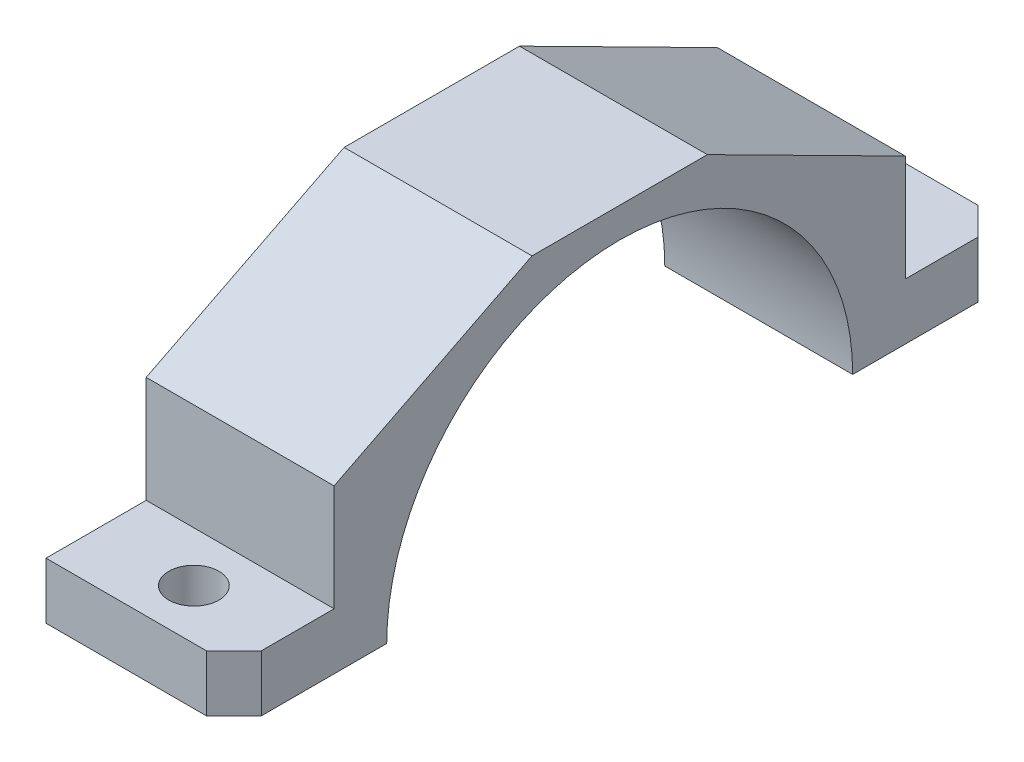
ISO-10303-21;
HEADER;
FILE_DESCRIPTION(('STEP AP214'),'2;1');
FILE_NAME('part.step','',(''),(''),'','','');
FILE_SCHEMA(('AUTOMOTIVE_DESIGN { 1 0 10303 214 1 1 1 1 }'));
ENDSEC;
DATA;
#1=APPLICATION_CONTEXT('core data for automotive mechanical design processes');
#2=APPLICATION_PROTOCOL_DEFINITION('international standard','automotive_design',2000,#1);
#3=PRODUCT_CONTEXT('',#1,'mechanical');
#4=PRODUCT('Part','Part','',(#3));
#5=PRODUCT_RELATED_PRODUCT_CATEGORY('part','',(#4));
#6=PRODUCT_DEFINITION_FORMATION('','',#4);
#7=PRODUCT_DEFINITION_CONTEXT('part definition',#1,'design');
#8=PRODUCT_DEFINITION('design','',#6,#7);
#9=PRODUCT_DEFINITION_SHAPE('','',#8);
#10=(LENGTH_UNIT() NAMED_UNIT(*) SI_UNIT(.MILLI.,.METRE.));
#11=(NAMED_UNIT(*) PLANE_ANGLE_UNIT() SI_UNIT($,.RADIAN.));
#12=(NAMED_UNIT(*) SI_UNIT($,.STERADIAN.) SOLID_ANGLE_UNIT());
#13=UNCERTAINTY_MEASURE_WITH_UNIT(LENGTH_MEASURE(1.E-05),#10,'distance_accuracy_value','');
#14=(GEOMETRIC_REPRESENTATION_CONTEXT(3) GLOBAL_UNCERTAINTY_ASSIGNED_CONTEXT((#13)) GLOBAL_UNIT_ASSIGNED_CONTEXT((#10,
#11,#12)) REPRESENTATION_CONTEXT('',''));
#15=CARTESIAN_POINT('',(0.,0.,0.));
#16=DIRECTION('',(0.,0.,1.));
#17=DIRECTION('',(1.,0.,0.));
#18=AXIS2_PLACEMENT_3D('',#15,#16,#17);
#19=CARTESIAN_POINT('',(7.5,13.,22.8));
#20=DIRECTION('',(0.,-0.892157158155219,-0.451725143369731));
#21=DIRECTION('',(0.,0.451725143369731,-0.892157158155219));
#22=AXIS2_PLACEMENT_3D('',#19,#20,#21);
#23=PLANE('',#22);
#24=DIRECTION('',(0.,-0.451725143369731,0.892157158155219));
#25=VECTOR('',#24,1.);
#26=CARTESIAN_POINT('',(-7.5,13.,22.8));
#27=LINE('',#26,#25);
#28=CARTESIAN_POINT('',(-7.5,21.,7.));
#29=VERTEX_POINT('',#28);
#30=CARTESIAN_POINT('',(-7.5,13.,22.8));
#31=VERTEX_POINT('',#30);
#32=EDGE_CURVE('E171',#29,#31,#27,.T.);
#33=ORIENTED_EDGE('',*,*,#32,.T.);
#34=DIRECTION('',(-1.,0.,0.));
#35=VECTOR('',#34,1.);
#36=CARTESIAN_POINT('',(7.5,13.,22.8));
#37=LINE('',#36,#35);
#38=CARTESIAN_POINT('',(7.5,13.,22.8));
#39=VERTEX_POINT('',#38);
#40=EDGE_CURVE('E226',#39,#31,#37,.T.);
#41=ORIENTED_EDGE('',*,*,#40,.F.);
#42=DIRECTION('',(0.,-0.451725143369731,0.892157158155219));
#43=VECTOR('',#42,1.);
#44=CARTESIAN_POINT('',(7.5,13.,22.8));
#45=LINE('',#44,#43);
#46=CARTESIAN_POINT('',(7.5,21.,7.));
#47=VERTEX_POINT('',#46);
#48=EDGE_CURVE('E199',#47,#39,#45,.T.);
#49=ORIENTED_EDGE('',*,*,#48,.F.);
#50=DIRECTION('',(-1.,0.,0.));
#51=VECTOR('',#50,1.);
#52=CARTESIAN_POINT('',(7.5,21.,7.));
#53=LINE('',#52,#51);
#54=EDGE_CURVE('E170',#47,#29,#53,.T.);
#55=ORIENTED_EDGE('',*,*,#54,.T.);
#56=EDGE_LOOP('',(#33,#41,#49,#55));
#57=FACE_BOUND('',#56,.T.);
#58=ADVANCED_FACE('F39',(#57),#23,.F.);
#59=CARTESIAN_POINT('',(7.5,4.5,22.8));
#60=DIRECTION('',(0.,0.,-1.));
#61=DIRECTION('',(-1.,0.,0.));
#62=AXIS2_PLACEMENT_3D('',#59,#60,#61);
#63=PLANE('',#62);
#64=DIRECTION('',(0.,-1.,0.));
#65=VECTOR('',#64,1.);
#66=CARTESIAN_POINT('',(-7.5,4.5,22.8));
#67=LINE('',#66,#65);
#68=CARTESIAN_POINT('',(-7.5,4.5,22.8));
#69=VERTEX_POINT('',#68);
#70=EDGE_CURVE('E174',#31,#69,#67,.T.);
#71=ORIENTED_EDGE('',*,*,#70,.T.);
#72=DIRECTION('',(-1.,0.,0.));
#73=VECTOR('',#72,1.);
#74=CARTESIAN_POINT('',(7.5,4.5,22.8));
#75=LINE('',#74,#73);
#76=CARTESIAN_POINT('',(7.5,4.5,22.8));
#77=VERTEX_POINT('',#76);
#78=EDGE_CURVE('E223',#77,#69,#75,.T.);
#79=ORIENTED_EDGE('',*,*,#78,.F.);
#80=DIRECTION('',(0.,-1.,0.));
#81=VECTOR('',#80,1.);
#82=CARTESIAN_POINT('',(7.5,4.5,22.8));
#83=LINE('',#82,#81);
#84=EDGE_CURVE('E238',#39,#77,#83,.T.);
#85=ORIENTED_EDGE('',*,*,#84,.F.);
#86=ORIENTED_EDGE('',*,*,#40,.T.);
#87=EDGE_LOOP('',(#71,#79,#85,#86));
#88=FACE_BOUND('',#87,.T.);
#89=ADVANCED_FACE('F286',(#88),#63,.F.);
#90=CARTESIAN_POINT('',(7.5,4.5,30.8));
#91=DIRECTION('',(0.,-1.,0.));
#92=DIRECTION('',(0.,0.,-1.));
#93=AXIS2_PLACEMENT_3D('',#90,#91,#92);
#94=PLANE('',#93);
#95=CARTESIAN_POINT('',(0.305249497121185,4.4999999999999,26.7999999999998));
#96=DIRECTION('',(0.,-1.,0.));
#97=DIRECTION('',(0.,0.,-1.));
#98=AXIS2_PLACEMENT_3D('',#95,#96,#97);
#99=CIRCLE('',#98,1.99999999999999);
#100=CARTESIAN_POINT('',(0.305249497121185,4.4999999999999,24.7999999999998));
#101=VERTEX_POINT('',#100);
#102=EDGE_CURVE('E251',#101,#101,#99,.T.);
#103=ORIENTED_EDGE('',*,*,#102,.T.);
#104=EDGE_LOOP('',(#103));
#105=FACE_BOUND('',#104,.T.);
#106=DIRECTION('',(-1.,0.,0.));
#107=VECTOR('',#106,1.);
#108=CARTESIAN_POINT('',(7.5,4.5,30.8));
#109=LINE('',#108,#107);
#110=CARTESIAN_POINT('',(5.30524949712216,4.50000000000001,30.8));
#111=VERTEX_POINT('',#110);
#112=CARTESIAN_POINT('',(-7.5,4.5,30.8));
#113=VERTEX_POINT('',#112);
#114=EDGE_CURVE('E221',#111,#113,#109,.T.);
#115=ORIENTED_EDGE('',*,*,#114,.F.);
#116=DIRECTION('',(0.70710678118655,0.,-0.707106781186545));
#117=VECTOR('',#116,1.);
#118=CARTESIAN_POINT('',(6.40262474856109,4.5,29.7026247485611));
#119=LINE('',#118,#117);
#120=CARTESIAN_POINT('',(7.5,4.50000000000001,28.6052494971222));
#121=VERTEX_POINT('',#120);
#122=EDGE_CURVE('E245',#111,#121,#119,.T.);
#123=ORIENTED_EDGE('',*,*,#122,.T.);
#124=DIRECTION('',(0.,0.,1.));
#125=VECTOR('',#124,1.);
#126=CARTESIAN_POINT('',(7.5,4.5,30.8));
#127=LINE('',#126,#125);
#128=EDGE_CURVE('E233',#77,#121,#127,.T.);
#129=ORIENTED_EDGE('',*,*,#128,.F.);
#130=ORIENTED_EDGE('',*,*,#78,.T.);
#131=DIRECTION('',(0.,0.,1.));
#132=VECTOR('',#131,1.);
#133=CARTESIAN_POINT('',(-7.5,4.5,30.8));
#134=LINE('',#133,#132);
#135=EDGE_CURVE('E176',#69,#113,#134,.T.);
#136=ORIENTED_EDGE('',*,*,#135,.T.);
#137=EDGE_LOOP('',(#115,#123,#129,#130,#136));
#138=FACE_BOUND('',#137,.T.);
#139=ADVANCED_FACE('F291',(#105,#138),#94,.F.);
#140=CARTESIAN_POINT('',(7.5,0.,30.8));
#141=DIRECTION('',(0.,0.,-1.));
#142=DIRECTION('',(-1.,0.,0.));
#143=AXIS2_PLACEMENT_3D('',#140,#141,#142);
#144=PLANE('',#143);
#145=DIRECTION('',(-1.,0.,0.));
#146=VECTOR('',#145,1.);
#147=CARTESIAN_POINT('',(7.5,0.,30.8));
#148=LINE('',#147,#146);
#149=CARTESIAN_POINT('',(5.30524949712216,0.,30.8));
#150=VERTEX_POINT('',#149);
#151=CARTESIAN_POINT('',(-7.5,0.,30.8));
#152=VERTEX_POINT('',#151);
#153=EDGE_CURVE('E219',#150,#152,#148,.T.);
#154=ORIENTED_EDGE('',*,*,#153,.F.);
#155=DIRECTION('',(0.,-1.,0.));
#156=VECTOR('',#155,1.);
#157=CARTESIAN_POINT('',(5.30524949712216,21.,30.8));
#158=LINE('',#157,#156);
#159=EDGE_CURVE('E248',#111,#150,#158,.T.);
#160=ORIENTED_EDGE('',*,*,#159,.F.);
#161=ORIENTED_EDGE('',*,*,#114,.T.);
#162=DIRECTION('',(0.,-1.,0.));
#163=VECTOR('',#162,1.);
#164=CARTESIAN_POINT('',(-7.5,0.,30.8));
#165=LINE('',#164,#163);
#166=EDGE_CURVE('E179',#113,#152,#165,.T.);
#167=ORIENTED_EDGE('',*,*,#166,.T.);
#168=EDGE_LOOP('',(#154,#160,#161,#167));
#169=FACE_BOUND('',#168,.T.);
#170=ADVANCED_FACE('F325',(#169),#144,.F.);
#171=CARTESIAN_POINT('',(7.5,0.,30.8));
#172=DIRECTION('',(0.,1.,0.));
#173=DIRECTION('',(0.,0.,1.));
#174=AXIS2_PLACEMENT_3D('',#171,#172,#173);
#175=PLANE('',#174);
#176=CARTESIAN_POINT('',(0.305249497121185,0.,26.7999999999998));
#177=DIRECTION('',(0.,1.,0.));
#178=DIRECTION('',(0.,0.,1.));
#179=AXIS2_PLACEMENT_3D('',#176,#177,#178);
#180=CIRCLE('',#179,2.);
#181=CARTESIAN_POINT('',(0.305249497121185,0.,28.7999999999998));
#182=VERTEX_POINT('',#181);
#183=EDGE_CURVE('E42',#182,#182,#180,.T.);
#184=ORIENTED_EDGE('',*,*,#183,.T.);
#185=EDGE_LOOP('',(#184));
#186=FACE_BOUND('',#185,.T.);
#187=DIRECTION('',(0.,0.,-1.));
#188=VECTOR('',#187,1.);
#189=CARTESIAN_POINT('',(7.5,0.,30.8));
#190=LINE('',#189,#188);
#191=CARTESIAN_POINT('',(7.5,0.,28.6052494971222));
#192=VERTEX_POINT('',#191);
#193=CARTESIAN_POINT('',(7.5,0.,18.6));
#194=VERTEX_POINT('',#193);
#195=EDGE_CURVE('E161',#192,#194,#190,.T.);
#196=ORIENTED_EDGE('',*,*,#195,.F.);
#197=DIRECTION('',(0.70710678118655,0.,-0.707106781186545));
#198=VECTOR('',#197,1.);
#199=CARTESIAN_POINT('',(5.30524949712216,0.,30.8));
#200=LINE('',#199,#198);
#201=EDGE_CURVE('E61',#150,#192,#200,.T.);
#202=ORIENTED_EDGE('',*,*,#201,.F.);
#203=ORIENTED_EDGE('',*,*,#153,.T.);
#204=DIRECTION('',(0.,0.,-1.));
#205=VECTOR('',#204,1.);
#206=CARTESIAN_POINT('',(-7.5,0.,30.8));
#207=LINE('',#206,#205);
#208=CARTESIAN_POINT('',(-7.5,0.,18.6));
#209=VERTEX_POINT('',#208);
#210=EDGE_CURVE('E182',#152,#209,#207,.T.);
#211=ORIENTED_EDGE('',*,*,#210,.T.);
#212=DIRECTION('',(-1.,0.,0.));
#213=VECTOR('',#212,1.);
#214=CARTESIAN_POINT('',(7.5,0.,18.6));
#215=LINE('',#214,#213);
#216=EDGE_CURVE('E216',#194,#209,#215,.T.);
#217=ORIENTED_EDGE('',*,*,#216,.F.);
#218=EDGE_LOOP('',(#196,#202,#203,#211,#217));
#219=FACE_BOUND('',#218,.T.);
#220=ADVANCED_FACE('F236',(#186,#219),#175,.F.);
#221=CARTESIAN_POINT('',(7.5,0.,0.));
#222=DIRECTION('',(-1.,0.,0.));
#223=DIRECTION('',(0.,0.,1.));
#224=AXIS2_PLACEMENT_3D('',#221,#222,#223);
#225=CYLINDRICAL_SURFACE('',#224,18.6);
#226=CARTESIAN_POINT('',(-7.5,0.,0.));
#227=DIRECTION('',(-1.,0.,0.));
#228=DIRECTION('',(0.,0.,1.));
#229=AXIS2_PLACEMENT_3D('',#226,#227,#228);
#230=CIRCLE('',#229,18.6);
#231=CARTESIAN_POINT('',(-7.5,0.,-18.6));
#232=VERTEX_POINT('',#231);
#233=EDGE_CURVE('E184',#209,#232,#230,.T.);
#234=ORIENTED_EDGE('',*,*,#233,.T.);
#235=DIRECTION('',(-1.,0.,0.));
#236=VECTOR('',#235,1.);
#237=CARTESIAN_POINT('',(7.5,0.,-18.6));
#238=LINE('',#237,#236);
#239=CARTESIAN_POINT('',(7.5,0.,-18.6));
#240=VERTEX_POINT('',#239);
#241=EDGE_CURVE('E214',#240,#232,#238,.T.);
#242=ORIENTED_EDGE('',*,*,#241,.F.);
#243=CARTESIAN_POINT('',(7.5,0.,0.));
#244=DIRECTION('',(-1.,0.,0.));
#245=DIRECTION('',(0.,0.,1.));
#246=AXIS2_PLACEMENT_3D('',#243,#244,#245);
#247=CIRCLE('',#246,18.6);
#248=EDGE_CURVE('E155',#194,#240,#247,.T.);
#249=ORIENTED_EDGE('',*,*,#248,.F.);
#250=ORIENTED_EDGE('',*,*,#216,.T.);
#251=EDGE_LOOP('',(#234,#242,#249,#250));
#252=FACE_BOUND('',#251,.T.);
#253=ADVANCED_FACE('F273',(#252),#225,.F.);
#254=CARTESIAN_POINT('',(7.5,0.,-18.6));
#255=DIRECTION('',(0.,1.,0.));
#256=DIRECTION('',(0.,0.,1.));
#257=AXIS2_PLACEMENT_3D('',#254,#255,#256);
#258=PLANE('',#257);
#259=CARTESIAN_POINT('',(0.305249497121185,0.,-26.8000000000003));
#260=DIRECTION('',(0.,1.,0.));
#261=DIRECTION('',(0.,0.,1.));
#262=AXIS2_PLACEMENT_3D('',#259,#260,#261);
#263=CIRCLE('',#262,2.);
#264=CARTESIAN_POINT('',(0.305249497121185,0.,-24.8000000000003));
#265=VERTEX_POINT('',#264);
#266=EDGE_CURVE('E254',#265,#265,#263,.T.);
#267=ORIENTED_EDGE('',*,*,#266,.T.);
#268=EDGE_LOOP('',(#267));
#269=FACE_BOUND('',#268,.T.);
#270=DIRECTION('',(-1.,0.,0.));
#271=VECTOR('',#270,1.);
#272=CARTESIAN_POINT('',(7.5,0.,-30.8));
#273=LINE('',#272,#271);
#274=CARTESIAN_POINT('',(5.30524949712216,0.,-30.8));
#275=VERTEX_POINT('',#274);
#276=CARTESIAN_POINT('',(-7.5,0.,-30.8));
#277=VERTEX_POINT('',#276);
#278=EDGE_CURVE('E150',#275,#277,#273,.T.);
#279=ORIENTED_EDGE('',*,*,#278,.F.);
#280=DIRECTION('',(-0.707106781186548,0.,-0.707106781186547));
#281=VECTOR('',#280,1.);
#282=CARTESIAN_POINT('',(5.30524949712216,0.,-30.8));
#283=LINE('',#282,#281);
#284=CARTESIAN_POINT('',(7.5,0.,-28.6052494971222));
#285=VERTEX_POINT('',#284);
#286=EDGE_CURVE('E138',#285,#275,#283,.T.);
#287=ORIENTED_EDGE('',*,*,#286,.F.);
#288=DIRECTION('',(0.,0.,-1.));
#289=VECTOR('',#288,1.);
#290=CARTESIAN_POINT('',(7.5,0.,-18.6));
#291=LINE('',#290,#289);
#292=EDGE_CURVE('E148',#240,#285,#291,.T.);
#293=ORIENTED_EDGE('',*,*,#292,.F.);
#294=ORIENTED_EDGE('',*,*,#241,.T.);
#295=DIRECTION('',(0.,0.,-1.));
#296=VECTOR('',#295,1.);
#297=CARTESIAN_POINT('',(-7.5,0.,-18.6));
#298=LINE('',#297,#296);
#299=EDGE_CURVE('E186',#232,#277,#298,.T.);
#300=ORIENTED_EDGE('',*,*,#299,.T.);
#301=EDGE_LOOP('',(#279,#287,#293,#294,#300));
#302=FACE_BOUND('',#301,.T.);
#303=ADVANCED_FACE('F146',(#269,#302),#258,.F.);
#304=CARTESIAN_POINT('',(7.5,4.5,-30.8));
#305=DIRECTION('',(0.,0.,1.));
#306=DIRECTION('',(1.,0.,0.));
#307=AXIS2_PLACEMENT_3D('',#304,#305,#306);
#308=PLANE('',#307);
#309=DIRECTION('',(-1.,0.,0.));
#310=VECTOR('',#309,1.);
#311=CARTESIAN_POINT('',(7.5,4.5,-30.8));
#312=LINE('',#311,#310);
#313=CARTESIAN_POINT('',(5.30524949712216,4.50000000000001,-30.8));
#314=VERTEX_POINT('',#313);
#315=CARTESIAN_POINT('',(-7.5,4.5,-30.8));
#316=VERTEX_POINT('',#315);
#317=EDGE_CURVE('E211',#314,#316,#312,.T.);
#318=ORIENTED_EDGE('',*,*,#317,.F.);
#319=DIRECTION('',(0.,-1.,0.));
#320=VECTOR('',#319,1.);
#321=CARTESIAN_POINT('',(5.30524949712216,21.,-30.8));
#322=LINE('',#321,#320);
#323=EDGE_CURVE('E151',#314,#275,#322,.T.);
#324=ORIENTED_EDGE('',*,*,#323,.T.);
#325=ORIENTED_EDGE('',*,*,#278,.T.);
#326=DIRECTION('',(0.,1.,0.));
#327=VECTOR('',#326,1.);
#328=CARTESIAN_POINT('',(-7.5,4.5,-30.8));
#329=LINE('',#328,#327);
#330=EDGE_CURVE('E188',#277,#316,#329,.T.);
#331=ORIENTED_EDGE('',*,*,#330,.T.);
#332=EDGE_LOOP('',(#318,#324,#325,#331));
#333=FACE_BOUND('',#332,.T.);
#334=ADVANCED_FACE('F272',(#333),#308,.F.);
#335=CARTESIAN_POINT('',(7.5,4.5,-22.8));
#336=DIRECTION('',(0.,-1.,0.));
#337=DIRECTION('',(0.,0.,-1.));
#338=AXIS2_PLACEMENT_3D('',#335,#336,#337);
#339=PLANE('',#338);
#340=CARTESIAN_POINT('',(0.305249497121185,4.4999999999999,-26.8000000000003));
#341=DIRECTION('',(0.,-1.,0.));
#342=DIRECTION('',(0.,0.,-1.));
#343=AXIS2_PLACEMENT_3D('',#340,#341,#342);
#344=CIRCLE('',#343,1.99999999999999);
#345=CARTESIAN_POINT('',(0.305249497121185,4.4999999999999,-28.8000000000003));
#346=VERTEX_POINT('',#345);
#347=EDGE_CURVE('E257',#346,#346,#344,.T.);
#348=ORIENTED_EDGE('',*,*,#347,.T.);
#349=EDGE_LOOP('',(#348));
#350=FACE_BOUND('',#349,.T.);
#351=DIRECTION('',(0.,0.,1.));
#352=VECTOR('',#351,1.);
#353=CARTESIAN_POINT('',(7.5,4.5,-22.8));
#354=LINE('',#353,#352);
#355=CARTESIAN_POINT('',(7.5,4.5,-28.6052494971222));
#356=VERTEX_POINT('',#355);
#357=CARTESIAN_POINT('',(7.5,4.5,-22.8));
#358=VERTEX_POINT('',#357);
#359=EDGE_CURVE('E157',#356,#358,#354,.T.);
#360=ORIENTED_EDGE('',*,*,#359,.F.);
#361=DIRECTION('',(-0.707106781186548,0.,-0.707106781186547));
#362=VECTOR('',#361,1.);
#363=CARTESIAN_POINT('',(10.4026247485611,4.5,-25.7026247485611));
#364=LINE('',#363,#362);
#365=EDGE_CURVE('E54',#356,#314,#364,.T.);
#366=ORIENTED_EDGE('',*,*,#365,.T.);
#367=ORIENTED_EDGE('',*,*,#317,.T.);
#368=DIRECTION('',(0.,0.,1.));
#369=VECTOR('',#368,1.);
#370=CARTESIAN_POINT('',(-7.5,4.5,-22.8));
#371=LINE('',#370,#369);
#372=CARTESIAN_POINT('',(-7.5,4.5,-22.8));
#373=VERTEX_POINT('',#372);
#374=EDGE_CURVE('E191',#316,#373,#371,.T.);
#375=ORIENTED_EDGE('',*,*,#374,.T.);
#376=DIRECTION('',(-1.,0.,0.));
#377=VECTOR('',#376,1.);
#378=CARTESIAN_POINT('',(7.5,4.5,-22.8));
#379=LINE('',#378,#377);
#380=EDGE_CURVE('E208',#358,#373,#379,.T.);
#381=ORIENTED_EDGE('',*,*,#380,.F.);
#382=EDGE_LOOP('',(#360,#366,#367,#375,#381));
#383=FACE_BOUND('',#382,.T.);
#384=ADVANCED_FACE('F261',(#350,#383),#339,.F.);
#385=CARTESIAN_POINT('',(7.5,13.,-22.8));
#386=DIRECTION('',(0.,0.,1.));
#387=DIRECTION('',(1.,0.,0.));
#388=AXIS2_PLACEMENT_3D('',#385,#386,#387);
#389=PLANE('',#388);
#390=DIRECTION('',(0.,1.,0.));
#391=VECTOR('',#390,1.);
#392=CARTESIAN_POINT('',(-7.5,13.,-22.8));
#393=LINE('',#392,#391);
#394=CARTESIAN_POINT('',(-7.5,13.,-22.8));
#395=VERTEX_POINT('',#394);
#396=EDGE_CURVE('E193',#373,#395,#393,.T.);
#397=ORIENTED_EDGE('',*,*,#396,.T.);
#398=DIRECTION('',(-1.,0.,0.));
#399=VECTOR('',#398,1.);
#400=CARTESIAN_POINT('',(7.5,13.,-22.8));
#401=LINE('',#400,#399);
#402=CARTESIAN_POINT('',(7.5,13.,-22.8));
#403=VERTEX_POINT('',#402);
#404=EDGE_CURVE('E205',#403,#395,#401,.T.);
#405=ORIENTED_EDGE('',*,*,#404,.F.);
#406=DIRECTION('',(0.,1.,0.));
#407=VECTOR('',#406,1.);
#408=CARTESIAN_POINT('',(7.5,13.,-22.8));
#409=LINE('',#408,#407);
#410=EDGE_CURVE('E159',#358,#403,#409,.T.);
#411=ORIENTED_EDGE('',*,*,#410,.F.);
#412=ORIENTED_EDGE('',*,*,#380,.T.);
#413=EDGE_LOOP('',(#397,#405,#411,#412));
#414=FACE_BOUND('',#413,.T.);
#415=ADVANCED_FACE('F316',(#414),#389,.F.);
#416=CARTESIAN_POINT('',(7.5,21.,-7.));
#417=DIRECTION('',(0.,-0.892157158155219,0.451725143369731));
#418=DIRECTION('',(0.,-0.451725143369731,-0.892157158155219));
#419=AXIS2_PLACEMENT_3D('',#416,#417,#418);
#420=PLANE('',#419);
#421=DIRECTION('',(0.,0.451725143369731,0.892157158155219));
#422=VECTOR('',#421,1.);
#423=CARTESIAN_POINT('',(-7.5,21.,-7.));
#424=LINE('',#423,#422);
#425=CARTESIAN_POINT('',(-7.5,21.,-7.));
#426=VERTEX_POINT('',#425);
#427=EDGE_CURVE('E195',#395,#426,#424,.T.);
#428=ORIENTED_EDGE('',*,*,#427,.T.);
#429=DIRECTION('',(-1.,0.,0.));
#430=VECTOR('',#429,1.);
#431=CARTESIAN_POINT('',(7.5,21.,-7.));
#432=LINE('',#431,#430);
#433=CARTESIAN_POINT('',(7.5,21.,-7.));
#434=VERTEX_POINT('',#433);
#435=EDGE_CURVE('E202',#434,#426,#432,.T.);
#436=ORIENTED_EDGE('',*,*,#435,.F.);
#437=DIRECTION('',(0.,0.451725143369731,0.892157158155219));
#438=VECTOR('',#437,1.);
#439=CARTESIAN_POINT('',(7.5,21.,-7.));
#440=LINE('',#439,#438);
#441=EDGE_CURVE('E166',#403,#434,#440,.T.);
#442=ORIENTED_EDGE('',*,*,#441,.F.);
#443=ORIENTED_EDGE('',*,*,#404,.T.);
#444=EDGE_LOOP('',(#428,#436,#442,#443));
#445=FACE_BOUND('',#444,.T.);
#446=ADVANCED_FACE('F310',(#445),#420,.F.);
#447=CARTESIAN_POINT('',(7.5,21.,7.));
#448=DIRECTION('',(0.,-1.,0.));
#449=DIRECTION('',(0.,0.,-1.));
#450=AXIS2_PLACEMENT_3D('',#447,#448,#449);
#451=PLANE('',#450);
#452=DIRECTION('',(0.,0.,1.));
#453=VECTOR('',#452,1.);
#454=CARTESIAN_POINT('',(-7.5,21.,7.));
#455=LINE('',#454,#453);
#456=EDGE_CURVE('E197',#426,#29,#455,.T.);
#457=ORIENTED_EDGE('',*,*,#456,.T.);
#458=ORIENTED_EDGE('',*,*,#54,.F.);
#459=DIRECTION('',(0.,0.,1.));
#460=VECTOR('',#459,1.);
#461=CARTESIAN_POINT('',(7.5,21.,7.));
#462=LINE('',#461,#460);
#463=EDGE_CURVE('E168',#434,#47,#462,.T.);
#464=ORIENTED_EDGE('',*,*,#463,.F.);
#465=ORIENTED_EDGE('',*,*,#435,.T.);
#466=EDGE_LOOP('',(#457,#458,#464,#465));
#467=FACE_BOUND('',#466,.T.);
#468=ADVANCED_FACE('F308',(#467),#451,.F.);
#469=CARTESIAN_POINT('',(7.5,0.,0.));
#470=DIRECTION('',(-1.,0.,0.));
#471=DIRECTION('',(0.,0.,1.));
#472=AXIS2_PLACEMENT_3D('',#469,#470,#471);
#473=PLANE('',#472);
#474=ORIENTED_EDGE('',*,*,#292,.T.);
#475=DIRECTION('',(0.,1.,0.));
#476=VECTOR('',#475,1.);
#477=CARTESIAN_POINT('',(7.5,0.,-28.6052494971222));
#478=LINE('',#477,#476);
#479=EDGE_CURVE('E11',#285,#356,#478,.T.);
#480=ORIENTED_EDGE('',*,*,#479,.T.);
#481=ORIENTED_EDGE('',*,*,#359,.T.);
#482=ORIENTED_EDGE('',*,*,#410,.T.);
#483=ORIENTED_EDGE('',*,*,#441,.T.);
#484=ORIENTED_EDGE('',*,*,#463,.T.);
#485=ORIENTED_EDGE('',*,*,#48,.T.);
#486=ORIENTED_EDGE('',*,*,#84,.T.);
#487=ORIENTED_EDGE('',*,*,#128,.T.);
#488=DIRECTION('',(0.,-1.,0.));
#489=VECTOR('',#488,1.);
#490=CARTESIAN_POINT('',(7.5,0.,28.6052494971222));
#491=LINE('',#490,#489);
#492=EDGE_CURVE('E47',#121,#192,#491,.T.);
#493=ORIENTED_EDGE('',*,*,#492,.T.);
#494=ORIENTED_EDGE('',*,*,#195,.T.);
#495=ORIENTED_EDGE('',*,*,#248,.T.);
#496=EDGE_LOOP('',(#474,#480,#481,#482,#483,#484,#485,#486,#487,#493,#494,#495));
#497=FACE_BOUND('',#496,.T.);
#498=ADVANCED_FACE('F153',(#497),#473,.F.);
#499=CARTESIAN_POINT('',(-7.5,0.,0.));
#500=DIRECTION('',(-1.,0.,0.));
#501=DIRECTION('',(0.,0.,1.));
#502=AXIS2_PLACEMENT_3D('',#499,#500,#501);
#503=PLANE('',#502);
#504=ORIENTED_EDGE('',*,*,#32,.F.);
#505=ORIENTED_EDGE('',*,*,#456,.F.);
#506=ORIENTED_EDGE('',*,*,#427,.F.);
#507=ORIENTED_EDGE('',*,*,#396,.F.);
#508=ORIENTED_EDGE('',*,*,#374,.F.);
#509=ORIENTED_EDGE('',*,*,#330,.F.);
#510=ORIENTED_EDGE('',*,*,#299,.F.);
#511=ORIENTED_EDGE('',*,*,#233,.F.);
#512=ORIENTED_EDGE('',*,*,#210,.F.);
#513=ORIENTED_EDGE('',*,*,#166,.F.);
#514=ORIENTED_EDGE('',*,*,#135,.F.);
#515=ORIENTED_EDGE('',*,*,#70,.F.);
#516=EDGE_LOOP('',(#504,#505,#506,#507,#508,#509,#510,#511,#512,#513,#514,#515));
#517=FACE_BOUND('',#516,.T.);
#518=ADVANCED_FACE('F299',(#517),#503,.T.);
#519=CARTESIAN_POINT('',(5.30524949712216,21.,30.8));
#520=DIRECTION('',(-0.707106781186545,0.,-0.70710678118655));
#521=DIRECTION('',(-0.70710678118655,0.,0.707106781186545));
#522=AXIS2_PLACEMENT_3D('',#519,#520,#521);
#523=PLANE('',#522);
#524=ORIENTED_EDGE('',*,*,#159,.T.);
#525=ORIENTED_EDGE('',*,*,#201,.T.);
#526=ORIENTED_EDGE('',*,*,#492,.F.);
#527=ORIENTED_EDGE('',*,*,#122,.F.);
#528=EDGE_LOOP('',(#524,#525,#526,#527));
#529=FACE_BOUND('',#528,.T.);
#530=ADVANCED_FACE('F328',(#529),#523,.F.);
#531=CARTESIAN_POINT('',(5.30524949712216,21.,-30.8));
#532=DIRECTION('',(-0.707106781186547,0.,0.707106781186548));
#533=DIRECTION('',(0.707106781186548,0.,0.707106781186547));
#534=AXIS2_PLACEMENT_3D('',#531,#532,#533);
#535=PLANE('',#534);
#536=ORIENTED_EDGE('',*,*,#479,.F.);
#537=ORIENTED_EDGE('',*,*,#286,.T.);
#538=ORIENTED_EDGE('',*,*,#323,.F.);
#539=ORIENTED_EDGE('',*,*,#365,.F.);
#540=EDGE_LOOP('',(#536,#537,#538,#539));
#541=FACE_BOUND('',#540,.T.);
#542=ADVANCED_FACE('F137',(#541),#535,.F.);
#543=CARTESIAN_POINT('',(0.305249497121185,-20.9999999999998,26.7999999999998));
#544=DIRECTION('',(0.,-1.,0.));
#545=DIRECTION('',(0.,0.,-1.));
#546=AXIS2_PLACEMENT_3D('',#543,#544,#545);
#547=CYLINDRICAL_SURFACE('',#546,2.);
#548=ORIENTED_EDGE('',*,*,#102,.F.);
#549=EDGE_LOOP('',(#548));
#550=FACE_BOUND('',#549,.T.);
#551=ORIENTED_EDGE('',*,*,#183,.F.);
#552=EDGE_LOOP('',(#551));
#553=FACE_BOUND('',#552,.T.);
#554=ADVANCED_FACE('F267',(#550,#553),#547,.F.);
#555=CARTESIAN_POINT('',(0.305249497121185,-20.9999999999998,-26.8000000000003));
#556=DIRECTION('',(0.,-1.,0.));
#557=DIRECTION('',(0.,0.,-1.));
#558=AXIS2_PLACEMENT_3D('',#555,#556,#557);
#559=CYLINDRICAL_SURFACE('',#558,2.);
#560=ORIENTED_EDGE('',*,*,#347,.F.);
#561=EDGE_LOOP('',(#560));
#562=FACE_BOUND('',#561,.T.);
#563=ORIENTED_EDGE('',*,*,#266,.F.);
#564=EDGE_LOOP('',(#563));
#565=FACE_BOUND('',#564,.T.);
#566=ADVANCED_FACE('F264',(#562,#565),#559,.F.);
#567=CLOSED_SHELL('',(#58,#89,#139,#170,#220,#253,#303,#334,#384,#415,#446,#468,#498,#518,#530,
#542,#554,#566));
#568=MANIFOLD_SOLID_BREP('B2',#567);
#569=ADVANCED_BREP_SHAPE_REPRESENTATION('',(#18,#568),#14);
#570=SHAPE_DEFINITION_REPRESENTATION(#9,#569);
ENDSEC;
END-ISO-10303-21;
